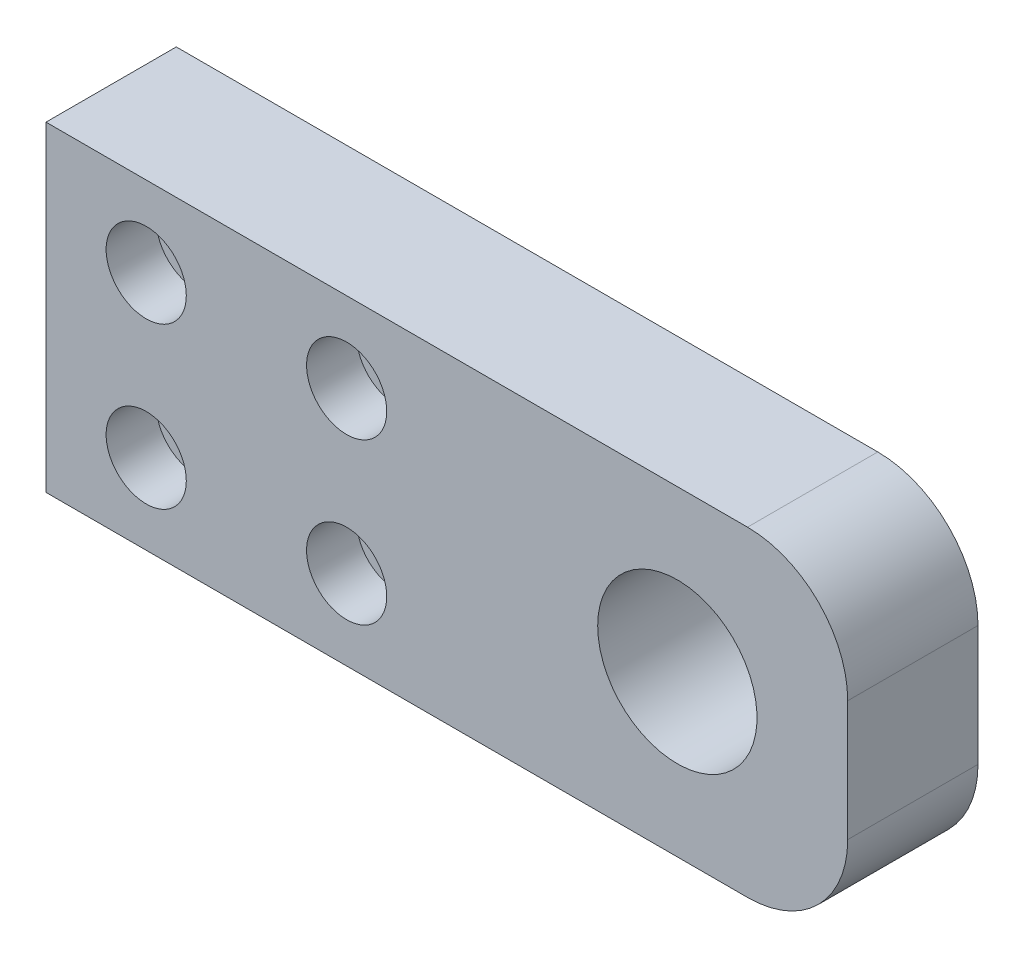
ISO-10303-21;
HEADER;
FILE_DESCRIPTION(('STEP AP214'),'2;1');
FILE_NAME('part.step','',(''),(''),'','','');
FILE_SCHEMA(('AUTOMOTIVE_DESIGN { 1 0 10303 214 1 1 1 1 }'));
ENDSEC;
DATA;
#1=APPLICATION_CONTEXT('core data for automotive mechanical design processes');
#2=APPLICATION_PROTOCOL_DEFINITION('international standard','automotive_design',2000,#1);
#3=PRODUCT_CONTEXT('',#1,'mechanical');
#4=PRODUCT('Part','Part','',(#3));
#5=PRODUCT_RELATED_PRODUCT_CATEGORY('part','',(#4));
#6=PRODUCT_DEFINITION_FORMATION('','',#4);
#7=PRODUCT_DEFINITION_CONTEXT('part definition',#1,'design');
#8=PRODUCT_DEFINITION('design','',#6,#7);
#9=PRODUCT_DEFINITION_SHAPE('','',#8);
#10=(LENGTH_UNIT() NAMED_UNIT(*) SI_UNIT(.MILLI.,.METRE.));
#11=(NAMED_UNIT(*) PLANE_ANGLE_UNIT() SI_UNIT($,.RADIAN.));
#12=(NAMED_UNIT(*) SI_UNIT($,.STERADIAN.) SOLID_ANGLE_UNIT());
#13=UNCERTAINTY_MEASURE_WITH_UNIT(LENGTH_MEASURE(1.E-05),#10,'distance_accuracy_value','');
#14=(GEOMETRIC_REPRESENTATION_CONTEXT(3) GLOBAL_UNCERTAINTY_ASSIGNED_CONTEXT((#13)) GLOBAL_UNIT_ASSIGNED_CONTEXT((#10,
#11,#12)) REPRESENTATION_CONTEXT('',''));
#15=CARTESIAN_POINT('',(0.,0.,0.));
#16=DIRECTION('',(0.,0.,1.));
#17=DIRECTION('',(1.,0.,0.));
#18=AXIS2_PLACEMENT_3D('',#15,#16,#17);
#19=CARTESIAN_POINT('',(6.83481049534862E-13,-43.9999999999982,-0.000999999999999265));
#20=DIRECTION('',(0.,0.,1.));
#21=DIRECTION('',(1.,0.,0.));
#22=AXIS2_PLACEMENT_3D('',#19,#20,#21);
#23=CYLINDRICAL_SURFACE('',#22,2.05);
#24=CARTESIAN_POINT('',(6.83481049534862E-13,-43.9999999999982,0.));
#25=DIRECTION('',(0.,0.,-1.));
#26=DIRECTION('',(-1.,0.,0.));
#27=AXIS2_PLACEMENT_3D('',#24,#25,#26);
#28=CIRCLE('',#27,2.05);
#29=CARTESIAN_POINT('',(-2.04999999999932,-43.9999999999982,0.));
#30=VERTEX_POINT('',#29);
#31=EDGE_CURVE('E189',#30,#30,#28,.F.);
#32=ORIENTED_EDGE('',*,*,#31,.F.);
#33=EDGE_LOOP('',(#32));
#34=FACE_BOUND('',#33,.T.);
#35=CARTESIAN_POINT('',(6.83481049534862E-13,-43.9999999999982,8.));
#36=DIRECTION('',(0.,0.,1.));
#37=DIRECTION('',(1.,0.,0.));
#38=AXIS2_PLACEMENT_3D('',#35,#36,#37);
#39=CIRCLE('',#38,2.05);
#40=CARTESIAN_POINT('',(2.05000000000069,-43.9999999999982,8.));
#41=VERTEX_POINT('',#40);
#42=EDGE_CURVE('E184',#41,#41,#39,.F.);
#43=ORIENTED_EDGE('',*,*,#42,.F.);
#44=EDGE_LOOP('',(#43));
#45=FACE_BOUND('',#44,.T.);
#46=ADVANCED_FACE('F39',(#34,#45),#23,.F.);
#47=CARTESIAN_POINT('',(20.0000000000007,-59.9999999999982,-0.000999999999999265));
#48=DIRECTION('',(0.,0.,1.));
#49=DIRECTION('',(1.,0.,0.));
#50=AXIS2_PLACEMENT_3D('',#47,#48,#49);
#51=CYLINDRICAL_SURFACE('',#50,2.05);
#52=CARTESIAN_POINT('',(20.0000000000007,-59.9999999999982,0.));
#53=DIRECTION('',(0.,0.,-1.));
#54=DIRECTION('',(-1.,0.,0.));
#55=AXIS2_PLACEMENT_3D('',#52,#53,#54);
#56=CIRCLE('',#55,2.05);
#57=CARTESIAN_POINT('',(17.9500000000007,-59.9999999999982,0.));
#58=VERTEX_POINT('',#57);
#59=EDGE_CURVE('E179',#58,#58,#56,.F.);
#60=ORIENTED_EDGE('',*,*,#59,.F.);
#61=EDGE_LOOP('',(#60));
#62=FACE_BOUND('',#61,.T.);
#63=CARTESIAN_POINT('',(20.0000000000007,-59.9999999999982,8.));
#64=DIRECTION('',(0.,0.,1.));
#65=DIRECTION('',(1.,0.,0.));
#66=AXIS2_PLACEMENT_3D('',#63,#64,#65);
#67=CIRCLE('',#66,2.05);
#68=CARTESIAN_POINT('',(22.0500000000007,-59.9999999999982,8.));
#69=VERTEX_POINT('',#68);
#70=EDGE_CURVE('E250',#69,#69,#67,.F.);
#71=ORIENTED_EDGE('',*,*,#70,.F.);
#72=EDGE_LOOP('',(#71));
#73=FACE_BOUND('',#72,.T.);
#74=ADVANCED_FACE('F335',(#62,#73),#51,.F.);
#75=CARTESIAN_POINT('',(6.83481049534862E-13,-59.9999999999982,-0.000999999999999265));
#76=DIRECTION('',(0.,0.,1.));
#77=DIRECTION('',(1.,0.,0.));
#78=AXIS2_PLACEMENT_3D('',#75,#76,#77);
#79=CYLINDRICAL_SURFACE('',#78,2.05);
#80=CARTESIAN_POINT('',(6.83481049534862E-13,-59.9999999999982,0.));
#81=DIRECTION('',(0.,0.,-1.));
#82=DIRECTION('',(-1.,0.,0.));
#83=AXIS2_PLACEMENT_3D('',#80,#81,#82);
#84=CIRCLE('',#83,2.05);
#85=CARTESIAN_POINT('',(-2.04999999999932,-59.9999999999982,0.));
#86=VERTEX_POINT('',#85);
#87=EDGE_CURVE('E183',#86,#86,#84,.F.);
#88=ORIENTED_EDGE('',*,*,#87,.F.);
#89=EDGE_LOOP('',(#88));
#90=FACE_BOUND('',#89,.T.);
#91=CARTESIAN_POINT('',(6.83481049534862E-13,-59.9999999999982,8.));
#92=DIRECTION('',(0.,0.,1.));
#93=DIRECTION('',(1.,0.,0.));
#94=AXIS2_PLACEMENT_3D('',#91,#92,#93);
#95=CIRCLE('',#94,2.05);
#96=CARTESIAN_POINT('',(2.05000000000069,-59.9999999999982,8.));
#97=VERTEX_POINT('',#96);
#98=EDGE_CURVE('E246',#97,#97,#95,.F.);
#99=ORIENTED_EDGE('',*,*,#98,.F.);
#100=EDGE_LOOP('',(#99));
#101=FACE_BOUND('',#100,.T.);
#102=ADVANCED_FACE('F340',(#90,#101),#79,.F.);
#103=CARTESIAN_POINT('',(20.0000000000007,-43.9999999999982,-0.000999999999999265));
#104=DIRECTION('',(0.,0.,1.));
#105=DIRECTION('',(1.,0.,0.));
#106=AXIS2_PLACEMENT_3D('',#103,#104,#105);
#107=CYLINDRICAL_SURFACE('',#106,2.05);
#108=CARTESIAN_POINT('',(20.0000000000007,-43.9999999999982,0.));
#109=DIRECTION('',(0.,0.,-1.));
#110=DIRECTION('',(-1.,0.,0.));
#111=AXIS2_PLACEMENT_3D('',#108,#109,#110);
#112=CIRCLE('',#111,2.05);
#113=CARTESIAN_POINT('',(17.9500000000007,-43.9999999999982,0.));
#114=VERTEX_POINT('',#113);
#115=EDGE_CURVE('E185',#114,#114,#112,.F.);
#116=ORIENTED_EDGE('',*,*,#115,.F.);
#117=EDGE_LOOP('',(#116));
#118=FACE_BOUND('',#117,.T.);
#119=CARTESIAN_POINT('',(20.0000000000007,-43.9999999999982,8.));
#120=DIRECTION('',(0.,0.,1.));
#121=DIRECTION('',(1.,0.,0.));
#122=AXIS2_PLACEMENT_3D('',#119,#120,#121);
#123=CIRCLE('',#122,2.05);
#124=CARTESIAN_POINT('',(22.0500000000007,-43.9999999999982,8.));
#125=VERTEX_POINT('',#124);
#126=EDGE_CURVE('E175',#125,#125,#123,.F.);
#127=ORIENTED_EDGE('',*,*,#126,.F.);
#128=EDGE_LOOP('',(#127));
#129=FACE_BOUND('',#128,.T.);
#130=ADVANCED_FACE('F347',(#118,#129),#107,.F.);
#131=CARTESIAN_POINT('',(0.,0.,13.));
#132=DIRECTION('',(0.,0.,-1.));
#133=DIRECTION('',(-1.,0.,0.));
#134=AXIS2_PLACEMENT_3D('',#131,#132,#133);
#135=PLANE('',#134);
#136=CARTESIAN_POINT('',(6.83481049534862E-13,-59.9999999999982,13.));
#137=DIRECTION('',(0.,0.,1.));
#138=DIRECTION('',(1.,0.,0.));
#139=AXIS2_PLACEMENT_3D('',#136,#137,#138);
#140=CIRCLE('',#139,4.);
#141=CARTESIAN_POINT('',(4.00000000000068,-59.9999999999982,13.));
#142=VERTEX_POINT('',#141);
#143=EDGE_CURVE('E140',#142,#142,#140,.T.);
#144=ORIENTED_EDGE('',*,*,#143,.F.);
#145=EDGE_LOOP('',(#144));
#146=FACE_BOUND('',#145,.T.);
#147=CARTESIAN_POINT('',(20.0000000000007,-59.9999999999982,13.));
#148=DIRECTION('',(0.,0.,1.));
#149=DIRECTION('',(1.,0.,0.));
#150=AXIS2_PLACEMENT_3D('',#147,#148,#149);
#151=CIRCLE('',#150,4.);
#152=CARTESIAN_POINT('',(24.0000000000007,-59.9999999999982,13.));
#153=VERTEX_POINT('',#152);
#154=EDGE_CURVE('E164',#153,#153,#151,.T.);
#155=ORIENTED_EDGE('',*,*,#154,.F.);
#156=EDGE_LOOP('',(#155));
#157=FACE_BOUND('',#156,.T.);
#158=CARTESIAN_POINT('',(20.0000000000007,-43.9999999999982,13.));
#159=DIRECTION('',(0.,0.,1.));
#160=DIRECTION('',(1.,0.,0.));
#161=AXIS2_PLACEMENT_3D('',#158,#159,#160);
#162=CIRCLE('',#161,4.);
#163=CARTESIAN_POINT('',(24.0000000000007,-43.9999999999982,13.));
#164=VERTEX_POINT('',#163);
#165=EDGE_CURVE('E156',#164,#164,#162,.T.);
#166=ORIENTED_EDGE('',*,*,#165,.F.);
#167=EDGE_LOOP('',(#166));
#168=FACE_BOUND('',#167,.T.);
#169=CARTESIAN_POINT('',(6.83481049534862E-13,-43.9999999999982,13.));
#170=DIRECTION('',(0.,0.,1.));
#171=DIRECTION('',(1.,0.,0.));
#172=AXIS2_PLACEMENT_3D('',#169,#170,#171);
#173=CIRCLE('',#172,4.);
#174=CARTESIAN_POINT('',(4.00000000000068,-43.9999999999982,13.));
#175=VERTEX_POINT('',#174);
#176=EDGE_CURVE('E155',#175,#175,#173,.T.);
#177=ORIENTED_EDGE('',*,*,#176,.F.);
#178=EDGE_LOOP('',(#177));
#179=FACE_BOUND('',#178,.T.);
#180=DIRECTION('',(1.,0.,0.));
#181=VECTOR('',#180,1.);
#182=CARTESIAN_POINT('',(-9.99999999999931,-67.9999999999982,13.));
#183=LINE('',#182,#181);
#184=CARTESIAN_POINT('',(-9.99999999999931,-67.9999999999982,13.));
#185=VERTEX_POINT('',#184);
#186=CARTESIAN_POINT('',(60.0000000000007,-67.9999999999982,13.));
#187=VERTEX_POINT('',#186);
#188=EDGE_CURVE('E209',#185,#187,#183,.T.);
#189=ORIENTED_EDGE('',*,*,#188,.T.);
#190=CARTESIAN_POINT('',(60.0000000000007,-57.9999999999982,13.));
#191=DIRECTION('',(0.,0.,-1.));
#192=DIRECTION('',(-1.,0.,0.));
#193=AXIS2_PLACEMENT_3D('',#190,#191,#192);
#194=CIRCLE('',#193,10.);
#195=CARTESIAN_POINT('',(70.0000000000007,-57.9999999999982,13.));
#196=VERTEX_POINT('',#195);
#197=EDGE_CURVE('E275',#187,#196,#194,.F.);
#198=ORIENTED_EDGE('',*,*,#197,.T.);
#199=DIRECTION('',(0.,1.,0.));
#200=VECTOR('',#199,1.);
#201=CARTESIAN_POINT('',(70.0000000000007,-67.9999999999982,13.));
#202=LINE('',#201,#200);
#203=CARTESIAN_POINT('',(70.0000000000007,-45.9999999999982,13.));
#204=VERTEX_POINT('',#203);
#205=EDGE_CURVE('E214',#196,#204,#202,.T.);
#206=ORIENTED_EDGE('',*,*,#205,.T.);
#207=CARTESIAN_POINT('',(60.0000000000007,-45.9999999999982,13.));
#208=DIRECTION('',(0.,0.,-1.));
#209=DIRECTION('',(-1.,0.,0.));
#210=AXIS2_PLACEMENT_3D('',#207,#208,#209);
#211=CIRCLE('',#210,10.);
#212=CARTESIAN_POINT('',(60.0000000000007,-35.9999999999982,13.));
#213=VERTEX_POINT('',#212);
#214=EDGE_CURVE('E272',#204,#213,#211,.F.);
#215=ORIENTED_EDGE('',*,*,#214,.T.);
#216=DIRECTION('',(-1.,0.,0.));
#217=VECTOR('',#216,1.);
#218=CARTESIAN_POINT('',(-9.99999999999931,-35.9999999999982,13.));
#219=LINE('',#218,#217);
#220=CARTESIAN_POINT('',(-9.99999999999931,-35.9999999999982,13.));
#221=VERTEX_POINT('',#220);
#222=EDGE_CURVE('E218',#213,#221,#219,.T.);
#223=ORIENTED_EDGE('',*,*,#222,.T.);
#224=DIRECTION('',(0.,-1.,0.));
#225=VECTOR('',#224,1.);
#226=CARTESIAN_POINT('',(-9.99999999999931,-67.9999999999982,13.));
#227=LINE('',#226,#225);
#228=EDGE_CURVE('E205',#221,#185,#227,.T.);
#229=ORIENTED_EDGE('',*,*,#228,.T.);
#230=EDGE_LOOP('',(#189,#198,#206,#215,#223,#229));
#231=FACE_BOUND('',#230,.T.);
#232=CARTESIAN_POINT('',(52.9999999999914,-51.9999999999982,13.));
#233=DIRECTION('',(0.,0.,1.));
#234=DIRECTION('',(1.,0.,0.));
#235=AXIS2_PLACEMENT_3D('',#232,#233,#234);
#236=CIRCLE('',#235,7.95000000000384);
#237=CARTESIAN_POINT('',(45.0499999999875,-51.9999999999982,13.));
#238=VERTEX_POINT('',#237);
#239=EDGE_CURVE('E197',#238,#238,#236,.T.);
#240=ORIENTED_EDGE('',*,*,#239,.F.);
#241=EDGE_LOOP('',(#240));
#242=FACE_BOUND('',#241,.T.);
#243=ADVANCED_FACE('F302',(#146,#157,#168,#179,#231,#242),#135,.F.);
#244=CARTESIAN_POINT('',(0.,0.,0.));
#245=DIRECTION('',(0.,0.,-1.));
#246=DIRECTION('',(-1.,0.,0.));
#247=AXIS2_PLACEMENT_3D('',#244,#245,#246);
#248=PLANE('',#247);
#249=DIRECTION('',(-1.,0.,0.));
#250=VECTOR('',#249,1.);
#251=CARTESIAN_POINT('',(30.0000000000007,-59.9999999999981,0.));
#252=LINE('',#251,#250);
#253=CARTESIAN_POINT('',(42.4161984870963,-59.9999999999981,0.));
#254=VERTEX_POINT('',#253);
#255=CARTESIAN_POINT('',(30.0000000000007,-59.9999999999981,0.));
#256=VERTEX_POINT('',#255);
#257=EDGE_CURVE('E55',#254,#256,#252,.T.);
#258=ORIENTED_EDGE('',*,*,#257,.F.);
#259=DIRECTION('',(0.,-1.,0.));
#260=VECTOR('',#259,1.);
#261=CARTESIAN_POINT('',(42.4161984870963,-43.9999999999982,0.));
#262=LINE('',#261,#260);
#263=CARTESIAN_POINT('',(42.4161984870963,-43.9999999999982,0.));
#264=VERTEX_POINT('',#263);
#265=EDGE_CURVE('E282',#254,#264,#262,.F.);
#266=ORIENTED_EDGE('',*,*,#265,.T.);
#267=DIRECTION('',(1.,0.,0.));
#268=VECTOR('',#267,1.);
#269=CARTESIAN_POINT('',(30.0000000000007,-43.9999999999982,0.));
#270=LINE('',#269,#268);
#271=CARTESIAN_POINT('',(30.0000000000007,-43.9999999999982,0.));
#272=VERTEX_POINT('',#271);
#273=EDGE_CURVE('E62',#272,#264,#270,.T.);
#274=ORIENTED_EDGE('',*,*,#273,.F.);
#275=DIRECTION('',(0.,1.,0.));
#276=VECTOR('',#275,1.);
#277=CARTESIAN_POINT('',(30.0000000000007,-43.9999999999982,0.));
#278=LINE('',#277,#276);
#279=EDGE_CURVE('E138',#256,#272,#278,.T.);
#280=ORIENTED_EDGE('',*,*,#279,.F.);
#281=EDGE_LOOP('',(#258,#266,#274,#280));
#282=FACE_BOUND('',#281,.T.);
#283=ORIENTED_EDGE('',*,*,#115,.T.);
#284=EDGE_LOOP('',(#283));
#285=FACE_BOUND('',#284,.T.);
#286=ORIENTED_EDGE('',*,*,#87,.T.);
#287=EDGE_LOOP('',(#286));
#288=FACE_BOUND('',#287,.T.);
#289=ORIENTED_EDGE('',*,*,#59,.T.);
#290=EDGE_LOOP('',(#289));
#291=FACE_BOUND('',#290,.T.);
#292=ORIENTED_EDGE('',*,*,#31,.T.);
#293=EDGE_LOOP('',(#292));
#294=FACE_BOUND('',#293,.T.);
#295=DIRECTION('',(0.,1.,0.));
#296=VECTOR('',#295,1.);
#297=CARTESIAN_POINT('',(70.0000000000007,-67.9999999999982,0.));
#298=LINE('',#297,#296);
#299=CARTESIAN_POINT('',(70.0000000000007,-57.9999999999982,0.));
#300=VERTEX_POINT('',#299);
#301=CARTESIAN_POINT('',(70.0000000000007,-45.9999999999982,0.));
#302=VERTEX_POINT('',#301);
#303=EDGE_CURVE('E229',#300,#302,#298,.T.);
#304=ORIENTED_EDGE('',*,*,#303,.F.);
#305=CARTESIAN_POINT('',(60.0000000000007,-57.9999999999982,0.));
#306=DIRECTION('',(0.,0.,-1.));
#307=DIRECTION('',(-1.,0.,0.));
#308=AXIS2_PLACEMENT_3D('',#305,#306,#307);
#309=CIRCLE('',#308,10.);
#310=CARTESIAN_POINT('',(60.0000000000007,-67.9999999999982,0.));
#311=VERTEX_POINT('',#310);
#312=EDGE_CURVE('E266',#300,#311,#309,.T.);
#313=ORIENTED_EDGE('',*,*,#312,.T.);
#314=DIRECTION('',(1.,0.,0.));
#315=VECTOR('',#314,1.);
#316=CARTESIAN_POINT('',(-9.99999999999931,-67.9999999999982,0.));
#317=LINE('',#316,#315);
#318=CARTESIAN_POINT('',(-9.99999999999931,-67.9999999999982,0.));
#319=VERTEX_POINT('',#318);
#320=EDGE_CURVE('E225',#319,#311,#317,.T.);
#321=ORIENTED_EDGE('',*,*,#320,.F.);
#322=DIRECTION('',(0.,-1.,0.));
#323=VECTOR('',#322,1.);
#324=CARTESIAN_POINT('',(-9.99999999999931,-67.9999999999982,0.));
#325=LINE('',#324,#323);
#326=CARTESIAN_POINT('',(-9.99999999999931,-35.9999999999982,0.));
#327=VERTEX_POINT('',#326);
#328=EDGE_CURVE('E201',#327,#319,#325,.T.);
#329=ORIENTED_EDGE('',*,*,#328,.F.);
#330=DIRECTION('',(-1.,0.,0.));
#331=VECTOR('',#330,1.);
#332=CARTESIAN_POINT('',(-9.99999999999931,-35.9999999999982,0.));
#333=LINE('',#332,#331);
#334=CARTESIAN_POINT('',(60.0000000000007,-35.9999999999982,0.));
#335=VERTEX_POINT('',#334);
#336=EDGE_CURVE('E210',#335,#327,#333,.T.);
#337=ORIENTED_EDGE('',*,*,#336,.F.);
#338=CARTESIAN_POINT('',(60.0000000000007,-45.9999999999982,0.));
#339=DIRECTION('',(0.,0.,-1.));
#340=DIRECTION('',(-1.,0.,0.));
#341=AXIS2_PLACEMENT_3D('',#338,#339,#340);
#342=CIRCLE('',#341,10.);
#343=EDGE_CURVE('E263',#335,#302,#342,.T.);
#344=ORIENTED_EDGE('',*,*,#343,.T.);
#345=EDGE_LOOP('',(#304,#313,#321,#329,#337,#344));
#346=FACE_BOUND('',#345,.T.);
#347=CARTESIAN_POINT('',(52.9999999999914,-51.9999999999982,0.));
#348=DIRECTION('',(0.,0.,1.));
#349=DIRECTION('',(1.,0.,0.));
#350=AXIS2_PLACEMENT_3D('',#347,#348,#349);
#351=CIRCLE('',#350,7.95000000000384);
#352=CARTESIAN_POINT('',(45.0499999999875,-51.9999999999982,0.));
#353=VERTEX_POINT('',#352);
#354=EDGE_CURVE('E196',#353,#353,#351,.T.);
#355=ORIENTED_EDGE('',*,*,#354,.T.);
#356=EDGE_LOOP('',(#355));
#357=FACE_BOUND('',#356,.T.);
#358=ADVANCED_FACE('F289',(#282,#285,#288,#291,#294,#346,#357),#248,.T.);
#359=CARTESIAN_POINT('',(-9.99999999999931,-67.9999999999982,13.));
#360=DIRECTION('',(1.,0.,0.));
#361=DIRECTION('',(0.,0.,-1.));
#362=AXIS2_PLACEMENT_3D('',#359,#360,#361);
#363=PLANE('',#362);
#364=ORIENTED_EDGE('',*,*,#328,.T.);
#365=DIRECTION('',(0.,0.,-1.));
#366=VECTOR('',#365,1.);
#367=CARTESIAN_POINT('',(-9.99999999999931,-67.9999999999982,13.));
#368=LINE('',#367,#366);
#369=EDGE_CURVE('E238',#185,#319,#368,.T.);
#370=ORIENTED_EDGE('',*,*,#369,.F.);
#371=ORIENTED_EDGE('',*,*,#228,.F.);
#372=DIRECTION('',(0.,0.,-1.));
#373=VECTOR('',#372,1.);
#374=CARTESIAN_POINT('',(-9.99999999999931,-35.9999999999982,13.));
#375=LINE('',#374,#373);
#376=EDGE_CURVE('E221',#221,#327,#375,.T.);
#377=ORIENTED_EDGE('',*,*,#376,.T.);
#378=EDGE_LOOP('',(#364,#370,#371,#377));
#379=FACE_BOUND('',#378,.T.);
#380=ADVANCED_FACE('F301',(#379),#363,.F.);
#381=CARTESIAN_POINT('',(-9.99999999999931,-67.9999999999982,13.));
#382=DIRECTION('',(0.,1.,0.));
#383=DIRECTION('',(0.,0.,1.));
#384=AXIS2_PLACEMENT_3D('',#381,#382,#383);
#385=PLANE('',#384);
#386=ORIENTED_EDGE('',*,*,#320,.T.);
#387=DIRECTION('',(0.,0.,-1.));
#388=VECTOR('',#387,1.);
#389=CARTESIAN_POINT('',(60.0000000000007,-67.9999999999982,13.));
#390=LINE('',#389,#388);
#391=EDGE_CURVE('E269',#311,#187,#390,.F.);
#392=ORIENTED_EDGE('',*,*,#391,.T.);
#393=ORIENTED_EDGE('',*,*,#188,.F.);
#394=ORIENTED_EDGE('',*,*,#369,.T.);
#395=EDGE_LOOP('',(#386,#392,#393,#394));
#396=FACE_BOUND('',#395,.T.);
#397=ADVANCED_FACE('F459',(#396),#385,.F.);
#398=CARTESIAN_POINT('',(70.0000000000007,-67.9999999999982,13.));
#399=DIRECTION('',(-1.,0.,0.));
#400=DIRECTION('',(0.,0.,1.));
#401=AXIS2_PLACEMENT_3D('',#398,#399,#400);
#402=PLANE('',#401);
#403=ORIENTED_EDGE('',*,*,#205,.F.);
#404=DIRECTION('',(0.,0.,-1.));
#405=VECTOR('',#404,1.);
#406=CARTESIAN_POINT('',(70.0000000000007,-57.9999999999982,13.));
#407=LINE('',#406,#405);
#408=EDGE_CURVE('E259',#196,#300,#407,.T.);
#409=ORIENTED_EDGE('',*,*,#408,.T.);
#410=ORIENTED_EDGE('',*,*,#303,.T.);
#411=DIRECTION('',(0.,0.,-1.));
#412=VECTOR('',#411,1.);
#413=CARTESIAN_POINT('',(70.0000000000007,-45.9999999999982,13.));
#414=LINE('',#413,#412);
#415=EDGE_CURVE('E242',#302,#204,#414,.F.);
#416=ORIENTED_EDGE('',*,*,#415,.T.);
#417=EDGE_LOOP('',(#403,#409,#410,#416));
#418=FACE_BOUND('',#417,.T.);
#419=ADVANCED_FACE('F329',(#418),#402,.F.);
#420=CARTESIAN_POINT('',(-9.99999999999931,-35.9999999999982,13.));
#421=DIRECTION('',(0.,-1.,0.));
#422=DIRECTION('',(0.,0.,-1.));
#423=AXIS2_PLACEMENT_3D('',#420,#421,#422);
#424=PLANE('',#423);
#425=ORIENTED_EDGE('',*,*,#222,.F.);
#426=DIRECTION('',(0.,0.,-1.));
#427=VECTOR('',#426,1.);
#428=CARTESIAN_POINT('',(60.0000000000007,-35.9999999999982,13.));
#429=LINE('',#428,#427);
#430=EDGE_CURVE('E278',#213,#335,#429,.T.);
#431=ORIENTED_EDGE('',*,*,#430,.T.);
#432=ORIENTED_EDGE('',*,*,#336,.T.);
#433=ORIENTED_EDGE('',*,*,#376,.F.);
#434=EDGE_LOOP('',(#425,#431,#432,#433));
#435=FACE_BOUND('',#434,.T.);
#436=ADVANCED_FACE('F319',(#435),#424,.F.);
#437=CARTESIAN_POINT('',(52.9999999999914,-51.9999999999982,13.));
#438=DIRECTION('',(0.,0.,-1.));
#439=DIRECTION('',(-1.,0.,0.));
#440=AXIS2_PLACEMENT_3D('',#437,#438,#439);
#441=CYLINDRICAL_SURFACE('',#440,7.95000000000384);
#442=CARTESIAN_POINT('',(45.0499999999875,-51.9999999999982,13.));
#443=CARTESIAN_POINT('',(45.0499999999875,-51.9999999999982,12.8645833333333));
#444=CARTESIAN_POINT('',(45.0499999999875,-51.9999999999982,12.7291666666667));
#445=CARTESIAN_POINT('',(45.0499999999875,-51.9999999999982,12.4583333333333));
#446=CARTESIAN_POINT('',(45.0499999999875,-51.9999999999982,12.3229166666667));
#447=CARTESIAN_POINT('',(45.0499999999875,-51.9999999999982,12.0520833333333));
#448=CARTESIAN_POINT('',(45.0499999999875,-51.9999999999982,11.9166666666667));
#449=CARTESIAN_POINT('',(45.0499999999875,-51.9999999999982,11.6458333333333));
#450=CARTESIAN_POINT('',(45.0499999999875,-51.9999999999982,11.5104166666667));
#451=CARTESIAN_POINT('',(45.0499999999875,-51.9999999999982,11.2395833333333));
#452=CARTESIAN_POINT('',(45.0499999999875,-51.9999999999982,11.1041666666667));
#453=CARTESIAN_POINT('',(45.0499999999875,-51.9999999999982,10.8333333333333));
#454=CARTESIAN_POINT('',(45.0499999999875,-51.9999999999982,10.6979166666667));
#455=CARTESIAN_POINT('',(45.0499999999875,-51.9999999999982,10.4270833333333));
#456=CARTESIAN_POINT('',(45.0499999999875,-51.9999999999982,10.2916666666667));
#457=CARTESIAN_POINT('',(45.0499999999875,-51.9999999999982,10.0208333333333));
#458=CARTESIAN_POINT('',(45.0499999999875,-51.9999999999982,9.88541666666667));
#459=CARTESIAN_POINT('',(45.0499999999875,-51.9999999999982,9.61458333333333));
#460=CARTESIAN_POINT('',(45.0499999999875,-51.9999999999982,9.47916666666667));
#461=CARTESIAN_POINT('',(45.0499999999875,-51.9999999999982,9.20833333333333));
#462=CARTESIAN_POINT('',(45.0499999999875,-51.9999999999982,9.07291666666667));
#463=CARTESIAN_POINT('',(45.0499999999875,-51.9999999999982,8.80208333333333));
#464=CARTESIAN_POINT('',(45.0499999999875,-51.9999999999982,8.66666666666667));
#465=CARTESIAN_POINT('',(45.0499999999875,-51.9999999999982,8.39583333333333));
#466=CARTESIAN_POINT('',(45.0499999999875,-51.9999999999982,8.26041666666667));
#467=CARTESIAN_POINT('',(45.0499999999875,-51.9999999999982,7.98958333333333));
#468=CARTESIAN_POINT('',(45.0499999999875,-51.9999999999982,7.85416666666667));
#469=CARTESIAN_POINT('',(45.0499999999875,-51.9999999999982,7.58333333333333));
#470=CARTESIAN_POINT('',(45.0499999999875,-51.9999999999982,7.44791666666667));
#471=CARTESIAN_POINT('',(45.0499999999875,-51.9999999999982,7.17708333333333));
#472=CARTESIAN_POINT('',(45.0499999999875,-51.9999999999982,7.04166666666667));
#473=CARTESIAN_POINT('',(45.0499999999875,-51.9999999999982,6.77083333333333));
#474=CARTESIAN_POINT('',(45.0499999999875,-51.9999999999982,6.63541666666667));
#475=CARTESIAN_POINT('',(45.0499999999875,-51.9999999999982,6.36458333333333));
#476=CARTESIAN_POINT('',(45.0499999999875,-51.9999999999982,6.22916666666667));
#477=CARTESIAN_POINT('',(45.0499999999875,-51.9999999999982,5.95833333333333));
#478=CARTESIAN_POINT('',(45.0499999999875,-51.9999999999982,5.82291666666667));
#479=CARTESIAN_POINT('',(45.0499999999875,-51.9999999999982,5.55208333333333));
#480=CARTESIAN_POINT('',(45.0499999999875,-51.9999999999982,5.41666666666667));
#481=CARTESIAN_POINT('',(45.0499999999875,-51.9999999999982,5.14583333333333));
#482=CARTESIAN_POINT('',(45.0499999999875,-51.9999999999982,5.01041666666667));
#483=CARTESIAN_POINT('',(45.0499999999875,-51.9999999999982,4.73958333333333));
#484=CARTESIAN_POINT('',(45.0499999999875,-51.9999999999982,4.60416666666667));
#485=CARTESIAN_POINT('',(45.0499999999875,-51.9999999999982,4.33333333333333));
#486=CARTESIAN_POINT('',(45.0499999999875,-51.9999999999982,4.19791666666667));
#487=CARTESIAN_POINT('',(45.0499999999875,-51.9999999999982,3.92708333333333));
#488=CARTESIAN_POINT('',(45.0499999999875,-51.9999999999982,3.79166666666667));
#489=CARTESIAN_POINT('',(45.0499999999875,-51.9999999999982,3.52083333333333));
#490=CARTESIAN_POINT('',(45.0499999999875,-51.9999999999982,3.38541666666667));
#491=CARTESIAN_POINT('',(45.0499999999875,-51.9999999999982,3.11458333333333));
#492=CARTESIAN_POINT('',(45.0499999999875,-51.9999999999982,2.97916666666667));
#493=CARTESIAN_POINT('',(45.0499999999875,-51.9999999999982,2.70833333333333));
#494=CARTESIAN_POINT('',(45.0499999999875,-51.9999999999982,2.57291666666667));
#495=CARTESIAN_POINT('',(45.0499999999875,-51.9999999999982,2.30208333333333));
#496=CARTESIAN_POINT('',(45.0499999999875,-51.9999999999982,2.16666666666667));
#497=CARTESIAN_POINT('',(45.0499999999875,-51.9999999999982,1.89583333333333));
#498=CARTESIAN_POINT('',(45.0499999999875,-51.9999999999982,1.76041666666667));
#499=CARTESIAN_POINT('',(45.0499999999875,-51.9999999999982,1.48958333333333));
#500=CARTESIAN_POINT('',(45.0499999999875,-51.9999999999982,1.35416666666667));
#501=CARTESIAN_POINT('',(45.0499999999875,-51.9999999999982,1.08333333333333));
#502=CARTESIAN_POINT('',(45.0499999999875,-51.9999999999982,0.947916666666667));
#503=CARTESIAN_POINT('',(45.0499999999875,-51.9999999999982,0.677083333333334));
#504=CARTESIAN_POINT('',(45.0499999999875,-51.9999999999982,0.541666666666667));
#505=CARTESIAN_POINT('',(45.0499999999875,-51.9999999999982,0.270833333333334));
#506=CARTESIAN_POINT('',(45.0499999999875,-51.9999999999982,0.135416666666667));
#507=CARTESIAN_POINT('',(45.0499999999875,-51.9999999999982,0.));
#508=B_SPLINE_CURVE_WITH_KNOTS('',3,(#442,#443,#444,#445,#446,#447,#448,#449,#450,#451,#452,
#453,#454,#455,#456,#457,#458,#459,#460,#461,#462,#463,#464,#465,#466,#467,#468,#469,#470,#471,
#472,#473,#474,#475,#476,#477,#478,#479,#480,#481,#482,#483,#484,#485,#486,#487,#488,#489,#490,
#491,#492,#493,#494,#495,#496,#497,#498,#499,#500,#501,#502,#503,#504,#505,#506,#507),
.UNSPECIFIED.,.F.,.F.,(4,2,2,2,2,2,2,2,2,2,2,2,2,2,2,2,2,2,2,2,2,2,2,2,2,2,2,2,2,2,2,2,4),(0.,
0.406249999999999,0.812499999999999,1.21875,1.625,2.03125,2.4375,2.84375,3.25,3.65625,4.0625,
4.46875,4.875,5.28125,5.6875,6.09375,6.5,6.90625,7.3125,7.71875,8.125,8.53125,8.9375,9.34375,
9.75,10.15625,10.5625,10.96875,11.375,11.78125,12.1875,12.59375,13.),.UNSPECIFIED.);
#509=EDGE_CURVE('BSEAM316',#238,#353,#508,.T.);
#510=ORIENTED_EDGE('',*,*,#239,.T.);
#511=ORIENTED_EDGE('',*,*,#354,.F.);
#512=ORIENTED_EDGE('',*,*,#509,.T.);
#513=ORIENTED_EDGE('',*,*,#509,.F.);
#514=EDGE_LOOP('',(#510,#512,#511,#513));
#515=FACE_BOUND('',#514,.T.);
#516=ADVANCED_FACE('F316',(#515),#441,.F.);
#517=CARTESIAN_POINT('',(20.0000000000007,-43.9999999999982,8.));
#518=DIRECTION('',(0.,0.,1.));
#519=DIRECTION('',(1.,0.,0.));
#520=AXIS2_PLACEMENT_3D('',#517,#518,#519);
#521=PLANE('',#520);
#522=CARTESIAN_POINT('',(20.0000000000007,-43.9999999999982,8.));
#523=DIRECTION('',(0.,0.,1.));
#524=DIRECTION('',(1.,0.,0.));
#525=AXIS2_PLACEMENT_3D('',#522,#523,#524);
#526=CIRCLE('',#525,4.);
#527=CARTESIAN_POINT('',(24.0000000000007,-43.9999999999982,8.));
#528=VERTEX_POINT('',#527);
#529=EDGE_CURVE('E151',#528,#528,#526,.T.);
#530=ORIENTED_EDGE('',*,*,#529,.T.);
#531=EDGE_LOOP('',(#530));
#532=FACE_BOUND('',#531,.T.);
#533=ORIENTED_EDGE('',*,*,#126,.T.);
#534=EDGE_LOOP('',(#533));
#535=FACE_BOUND('',#534,.T.);
#536=ADVANCED_FACE('F318',(#532,#535),#521,.T.);
#537=CARTESIAN_POINT('',(20.0000000000007,-43.9999999999982,8.));
#538=DIRECTION('',(0.,0.,1.));
#539=DIRECTION('',(1.,0.,0.));
#540=AXIS2_PLACEMENT_3D('',#537,#538,#539);
#541=CYLINDRICAL_SURFACE('',#540,4.);
#542=ORIENTED_EDGE('',*,*,#529,.F.);
#543=EDGE_LOOP('',(#542));
#544=FACE_BOUND('',#543,.T.);
#545=ORIENTED_EDGE('',*,*,#165,.T.);
#546=EDGE_LOOP('',(#545));
#547=FACE_BOUND('',#546,.T.);
#548=ADVANCED_FACE('F326',(#544,#547),#541,.F.);
#549=CARTESIAN_POINT('',(6.83481049534862E-13,-59.9999999999982,8.));
#550=DIRECTION('',(0.,0.,1.));
#551=DIRECTION('',(1.,0.,0.));
#552=AXIS2_PLACEMENT_3D('',#549,#550,#551);
#553=PLANE('',#552);
#554=CARTESIAN_POINT('',(6.83481049534862E-13,-59.9999999999982,8.));
#555=DIRECTION('',(0.,0.,1.));
#556=DIRECTION('',(1.,0.,0.));
#557=AXIS2_PLACEMENT_3D('',#554,#555,#556);
#558=CIRCLE('',#557,4.);
#559=CARTESIAN_POINT('',(4.00000000000068,-59.9999999999982,8.));
#560=VERTEX_POINT('',#559);
#561=EDGE_CURVE('E146',#560,#560,#558,.T.);
#562=ORIENTED_EDGE('',*,*,#561,.T.);
#563=EDGE_LOOP('',(#562));
#564=FACE_BOUND('',#563,.T.);
#565=ORIENTED_EDGE('',*,*,#98,.T.);
#566=EDGE_LOOP('',(#565));
#567=FACE_BOUND('',#566,.T.);
#568=ADVANCED_FACE('F366',(#564,#567),#553,.T.);
#569=CARTESIAN_POINT('',(6.83481049534862E-13,-59.9999999999982,8.));
#570=DIRECTION('',(0.,0.,1.));
#571=DIRECTION('',(1.,0.,0.));
#572=AXIS2_PLACEMENT_3D('',#569,#570,#571);
#573=CYLINDRICAL_SURFACE('',#572,4.);
#574=ORIENTED_EDGE('',*,*,#561,.F.);
#575=EDGE_LOOP('',(#574));
#576=FACE_BOUND('',#575,.T.);
#577=ORIENTED_EDGE('',*,*,#143,.T.);
#578=EDGE_LOOP('',(#577));
#579=FACE_BOUND('',#578,.T.);
#580=ADVANCED_FACE('F362',(#576,#579),#573,.F.);
#581=CARTESIAN_POINT('',(20.0000000000007,-59.9999999999982,8.));
#582=DIRECTION('',(0.,0.,1.));
#583=DIRECTION('',(1.,0.,0.));
#584=AXIS2_PLACEMENT_3D('',#581,#582,#583);
#585=PLANE('',#584);
#586=CARTESIAN_POINT('',(20.0000000000007,-59.9999999999982,8.));
#587=DIRECTION('',(0.,0.,1.));
#588=DIRECTION('',(1.,0.,0.));
#589=AXIS2_PLACEMENT_3D('',#586,#587,#588);
#590=CIRCLE('',#589,4.);
#591=CARTESIAN_POINT('',(24.0000000000007,-59.9999999999982,8.));
#592=VERTEX_POINT('',#591);
#593=EDGE_CURVE('E160',#592,#592,#590,.T.);
#594=ORIENTED_EDGE('',*,*,#593,.T.);
#595=EDGE_LOOP('',(#594));
#596=FACE_BOUND('',#595,.T.);
#597=ORIENTED_EDGE('',*,*,#70,.T.);
#598=EDGE_LOOP('',(#597));
#599=FACE_BOUND('',#598,.T.);
#600=ADVANCED_FACE('F365',(#596,#599),#585,.T.);
#601=CARTESIAN_POINT('',(20.0000000000007,-59.9999999999982,8.));
#602=DIRECTION('',(0.,0.,1.));
#603=DIRECTION('',(1.,0.,0.));
#604=AXIS2_PLACEMENT_3D('',#601,#602,#603);
#605=CYLINDRICAL_SURFACE('',#604,4.);
#606=ORIENTED_EDGE('',*,*,#593,.F.);
#607=EDGE_LOOP('',(#606));
#608=FACE_BOUND('',#607,.T.);
#609=ORIENTED_EDGE('',*,*,#154,.T.);
#610=EDGE_LOOP('',(#609));
#611=FACE_BOUND('',#610,.T.);
#612=ADVANCED_FACE('F360',(#608,#611),#605,.F.);
#613=CARTESIAN_POINT('',(6.83481049534862E-13,-43.9999999999982,8.));
#614=DIRECTION('',(0.,0.,1.));
#615=DIRECTION('',(1.,0.,0.));
#616=AXIS2_PLACEMENT_3D('',#613,#614,#615);
#617=PLANE('',#616);
#618=CARTESIAN_POINT('',(6.83481049534862E-13,-43.9999999999982,8.));
#619=DIRECTION('',(0.,0.,1.));
#620=DIRECTION('',(1.,0.,0.));
#621=AXIS2_PLACEMENT_3D('',#618,#619,#620);
#622=CIRCLE('',#621,4.);
#623=CARTESIAN_POINT('',(4.00000000000068,-43.9999999999982,8.));
#624=VERTEX_POINT('',#623);
#625=EDGE_CURVE('E171',#624,#624,#622,.T.);
#626=ORIENTED_EDGE('',*,*,#625,.T.);
#627=EDGE_LOOP('',(#626));
#628=FACE_BOUND('',#627,.T.);
#629=ORIENTED_EDGE('',*,*,#42,.T.);
#630=EDGE_LOOP('',(#629));
#631=FACE_BOUND('',#630,.T.);
#632=ADVANCED_FACE('F356',(#628,#631),#617,.T.);
#633=CARTESIAN_POINT('',(6.83481049534862E-13,-43.9999999999982,8.));
#634=DIRECTION('',(0.,0.,1.));
#635=DIRECTION('',(1.,0.,0.));
#636=AXIS2_PLACEMENT_3D('',#633,#634,#635);
#637=CYLINDRICAL_SURFACE('',#636,4.);
#638=ORIENTED_EDGE('',*,*,#625,.F.);
#639=EDGE_LOOP('',(#638));
#640=FACE_BOUND('',#639,.T.);
#641=ORIENTED_EDGE('',*,*,#176,.T.);
#642=EDGE_LOOP('',(#641));
#643=FACE_BOUND('',#642,.T.);
#644=ADVANCED_FACE('F352',(#640,#643),#637,.F.);
#645=CARTESIAN_POINT('',(60.0000000000007,-57.9999999999982,13.));
#646=DIRECTION('',(0.,0.,-1.));
#647=DIRECTION('',(-1.,0.,0.));
#648=AXIS2_PLACEMENT_3D('',#645,#646,#647);
#649=CYLINDRICAL_SURFACE('',#648,10.);
#650=ORIENTED_EDGE('',*,*,#197,.F.);
#651=ORIENTED_EDGE('',*,*,#391,.F.);
#652=ORIENTED_EDGE('',*,*,#312,.F.);
#653=ORIENTED_EDGE('',*,*,#408,.F.);
#654=EDGE_LOOP('',(#650,#651,#652,#653));
#655=FACE_BOUND('',#654,.T.);
#656=ADVANCED_FACE('F355',(#655),#649,.T.);
#657=CARTESIAN_POINT('',(60.0000000000007,-45.9999999999982,13.));
#658=DIRECTION('',(0.,0.,-1.));
#659=DIRECTION('',(-1.,0.,0.));
#660=AXIS2_PLACEMENT_3D('',#657,#658,#659);
#661=CYLINDRICAL_SURFACE('',#660,10.);
#662=ORIENTED_EDGE('',*,*,#214,.F.);
#663=ORIENTED_EDGE('',*,*,#415,.F.);
#664=ORIENTED_EDGE('',*,*,#343,.F.);
#665=ORIENTED_EDGE('',*,*,#430,.F.);
#666=EDGE_LOOP('',(#662,#663,#664,#665));
#667=FACE_BOUND('',#666,.T.);
#668=ADVANCED_FACE('F382',(#667),#661,.T.);
#669=CARTESIAN_POINT('',(30.0000000000007,-43.9999999999982,-5.));
#670=DIRECTION('',(1.,0.,0.));
#671=DIRECTION('',(0.,1.,0.));
#672=AXIS2_PLACEMENT_3D('',#669,#670,#671);
#673=PLANE('',#672);
#674=ORIENTED_EDGE('',*,*,#279,.T.);
#675=DIRECTION('',(0.,0.,1.));
#676=VECTOR('',#675,1.);
#677=CARTESIAN_POINT('',(30.0000000000007,-43.9999999999982,-5.));
#678=LINE('',#677,#676);
#679=CARTESIAN_POINT('',(30.0000000000007,-43.9999999999982,-5.));
#680=VERTEX_POINT('',#679);
#681=EDGE_CURVE('E118',#680,#272,#678,.T.);
#682=ORIENTED_EDGE('',*,*,#681,.F.);
#683=DIRECTION('',(0.,1.,0.));
#684=VECTOR('',#683,1.);
#685=CARTESIAN_POINT('',(30.0000000000007,-43.9999999999982,-5.));
#686=LINE('',#685,#684);
#687=CARTESIAN_POINT('',(30.0000000000007,-59.9999999999981,-5.));
#688=VERTEX_POINT('',#687);
#689=EDGE_CURVE('E126',#688,#680,#686,.T.);
#690=ORIENTED_EDGE('',*,*,#689,.F.);
#691=DIRECTION('',(0.,0.,1.));
#692=VECTOR('',#691,1.);
#693=CARTESIAN_POINT('',(30.0000000000007,-59.9999999999981,-5.));
#694=LINE('',#693,#692);
#695=EDGE_CURVE('E141',#688,#256,#694,.T.);
#696=ORIENTED_EDGE('',*,*,#695,.T.);
#697=EDGE_LOOP('',(#674,#682,#690,#696));
#698=FACE_BOUND('',#697,.T.);
#699=ADVANCED_FACE('F137',(#698),#673,.F.);
#700=CARTESIAN_POINT('',(30.0000000000007,-43.9999999999982,-5.));
#701=DIRECTION('',(0.,-1.,0.));
#702=DIRECTION('',(0.,0.,-1.));
#703=AXIS2_PLACEMENT_3D('',#700,#701,#702);
#704=PLANE('',#703);
#705=ORIENTED_EDGE('',*,*,#273,.T.);
#706=CARTESIAN_POINT('',(42.4161984870963,-43.9999999999982,-8.));
#707=DIRECTION('',(0.,-1.,0.));
#708=DIRECTION('',(0.,0.,-1.));
#709=AXIS2_PLACEMENT_3D('',#706,#707,#708);
#710=CIRCLE('',#709,8.);
#711=CARTESIAN_POINT('',(35.0000000000007,-43.9999999999982,-5.));
#712=VERTEX_POINT('',#711);
#713=EDGE_CURVE('E11',#264,#712,#710,.T.);
#714=ORIENTED_EDGE('',*,*,#713,.T.);
#715=DIRECTION('',(1.,0.,0.));
#716=VECTOR('',#715,1.);
#717=CARTESIAN_POINT('',(30.0000000000007,-43.9999999999982,-5.));
#718=LINE('',#717,#716);
#719=EDGE_CURVE('E114',#680,#712,#718,.T.);
#720=ORIENTED_EDGE('',*,*,#719,.F.);
#721=ORIENTED_EDGE('',*,*,#681,.T.);
#722=EDGE_LOOP('',(#705,#714,#720,#721));
#723=FACE_BOUND('',#722,.T.);
#724=ADVANCED_FACE('F116',(#723),#704,.F.);
#725=CARTESIAN_POINT('',(30.0000000000007,-59.9999999999981,-5.));
#726=DIRECTION('',(0.,1.,0.));
#727=DIRECTION('',(0.,0.,1.));
#728=AXIS2_PLACEMENT_3D('',#725,#726,#727);
#729=PLANE('',#728);
#730=ORIENTED_EDGE('',*,*,#257,.T.);
#731=ORIENTED_EDGE('',*,*,#695,.F.);
#732=DIRECTION('',(-1.,0.,0.));
#733=VECTOR('',#732,1.);
#734=CARTESIAN_POINT('',(30.0000000000007,-59.9999999999981,-5.));
#735=LINE('',#734,#733);
#736=CARTESIAN_POINT('',(35.0000000000007,-59.9999999999981,-5.));
#737=VERTEX_POINT('',#736);
#738=EDGE_CURVE('E131',#737,#688,#735,.T.);
#739=ORIENTED_EDGE('',*,*,#738,.F.);
#740=CARTESIAN_POINT('',(42.4161984870963,-59.9999999999981,-8.));
#741=DIRECTION('',(0.,1.,0.));
#742=DIRECTION('',(0.,0.,1.));
#743=AXIS2_PLACEMENT_3D('',#740,#741,#742);
#744=CIRCLE('',#743,8.);
#745=EDGE_CURVE('E48',#737,#254,#744,.T.);
#746=ORIENTED_EDGE('',*,*,#745,.T.);
#747=EDGE_LOOP('',(#730,#731,#739,#746));
#748=FACE_BOUND('',#747,.T.);
#749=ADVANCED_FACE('F287',(#748),#729,.F.);
#750=CARTESIAN_POINT('',(0.,0.,-5.));
#751=DIRECTION('',(0.,0.,1.));
#752=DIRECTION('',(1.,0.,0.));
#753=AXIS2_PLACEMENT_3D('',#750,#751,#752);
#754=PLANE('',#753);
#755=ORIENTED_EDGE('',*,*,#689,.T.);
#756=ORIENTED_EDGE('',*,*,#719,.T.);
#757=DIRECTION('',(0.,-1.,0.));
#758=VECTOR('',#757,1.);
#759=CARTESIAN_POINT('',(35.0000000000007,-43.9999999999982,-5.));
#760=LINE('',#759,#758);
#761=EDGE_CURVE('E125',#712,#737,#760,.T.);
#762=ORIENTED_EDGE('',*,*,#761,.T.);
#763=ORIENTED_EDGE('',*,*,#738,.T.);
#764=EDGE_LOOP('',(#755,#756,#762,#763));
#765=FACE_BOUND('',#764,.T.);
#766=ADVANCED_FACE('F129',(#765),#754,.F.);
#767=CARTESIAN_POINT('',(42.4161984870963,-43.9999999999982,-8.));
#768=DIRECTION('',(0.,1.,0.));
#769=DIRECTION('',(0.,0.,1.));
#770=AXIS2_PLACEMENT_3D('',#767,#768,#769);
#771=CYLINDRICAL_SURFACE('',#770,8.);
#772=ORIENTED_EDGE('',*,*,#713,.F.);
#773=ORIENTED_EDGE('',*,*,#265,.F.);
#774=ORIENTED_EDGE('',*,*,#745,.F.);
#775=ORIENTED_EDGE('',*,*,#761,.F.);
#776=EDGE_LOOP('',(#772,#773,#774,#775));
#777=FACE_BOUND('',#776,.T.);
#778=ADVANCED_FACE('F41',(#777),#771,.F.);
#779=CLOSED_SHELL('',(#46,#74,#102,#130,#243,#358,#380,#397,#419,#436,#516,#536,#548,#568,#580,
#600,#612,#632,#644,#656,#668,#699,#724,#749,#766,#778));
#780=MANIFOLD_SOLID_BREP('B2',#779);
#781=ADVANCED_BREP_SHAPE_REPRESENTATION('',(#18,#780),#14);
#782=SHAPE_DEFINITION_REPRESENTATION(#9,#781);
ENDSEC;
END-ISO-10303-21;
